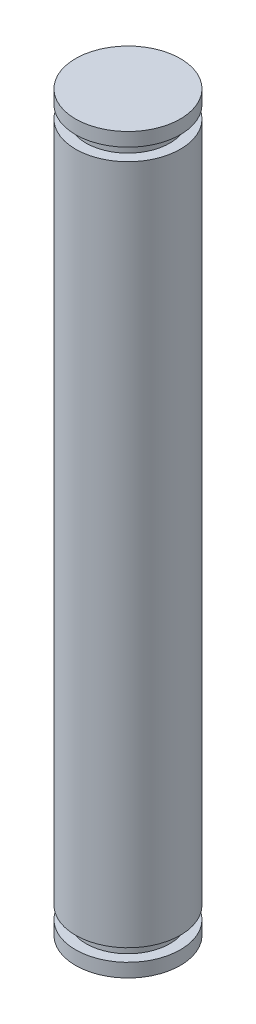
ISO-10303-21;
HEADER;
FILE_DESCRIPTION(('STEP AP214'),'2;1');
FILE_NAME('part.step','',(''),(''),'','','');
FILE_SCHEMA(('AUTOMOTIVE_DESIGN { 1 0 10303 214 1 1 1 1 }'));
ENDSEC;
DATA;
#1=APPLICATION_CONTEXT('core data for automotive mechanical design processes');
#2=APPLICATION_PROTOCOL_DEFINITION('international standard','automotive_design',2000,#1);
#3=PRODUCT_CONTEXT('',#1,'mechanical');
#4=PRODUCT('Part','Part','',(#3));
#5=PRODUCT_RELATED_PRODUCT_CATEGORY('part','',(#4));
#6=PRODUCT_DEFINITION_FORMATION('','',#4);
#7=PRODUCT_DEFINITION_CONTEXT('part definition',#1,'design');
#8=PRODUCT_DEFINITION('design','',#6,#7);
#9=PRODUCT_DEFINITION_SHAPE('','',#8);
#10=(LENGTH_UNIT() NAMED_UNIT(*) SI_UNIT(.MILLI.,.METRE.));
#11=(NAMED_UNIT(*) PLANE_ANGLE_UNIT() SI_UNIT($,.RADIAN.));
#12=(NAMED_UNIT(*) SI_UNIT($,.STERADIAN.) SOLID_ANGLE_UNIT());
#13=UNCERTAINTY_MEASURE_WITH_UNIT(LENGTH_MEASURE(1.E-05),#10,'distance_accuracy_value','');
#14=(GEOMETRIC_REPRESENTATION_CONTEXT(3) GLOBAL_UNCERTAINTY_ASSIGNED_CONTEXT((#13)) GLOBAL_UNIT_ASSIGNED_CONTEXT((#10,
#11,#12)) REPRESENTATION_CONTEXT('',''));
#15=CARTESIAN_POINT('',(0.,0.,0.));
#16=DIRECTION('',(0.,0.,1.));
#17=DIRECTION('',(1.,0.,0.));
#18=AXIS2_PLACEMENT_3D('',#15,#16,#17);
#19=CARTESIAN_POINT('',(0.,0.,0.));
#20=DIRECTION('',(0.,-1.,0.));
#21=DIRECTION('',(0.,0.,-1.));
#22=AXIS2_PLACEMENT_3D('',#19,#20,#21);
#23=PLANE('',#22);
#24=CARTESIAN_POINT('',(0.,0.,0.));
#25=DIRECTION('',(0.,1.,0.));
#26=DIRECTION('',(0.,0.,1.));
#27=AXIS2_PLACEMENT_3D('',#24,#25,#26);
#28=CIRCLE('',#27,5.);
#29=CARTESIAN_POINT('',(0.,0.,5.));
#30=VERTEX_POINT('',#29);
#31=EDGE_CURVE('E10',#30,#30,#28,.T.);
#32=ORIENTED_EDGE('',*,*,#31,.F.);
#33=EDGE_LOOP('',(#32));
#34=FACE_BOUND('',#33,.T.);
#35=ADVANCED_FACE('F35',(#34),#23,.T.);
#36=CARTESIAN_POINT('',(0.,70.,0.));
#37=DIRECTION('',(0.,1.,0.));
#38=DIRECTION('',(0.,0.,1.));
#39=AXIS2_PLACEMENT_3D('',#36,#37,#38);
#40=CYLINDRICAL_SURFACE('',#39,5.);
#41=ORIENTED_EDGE('',*,*,#31,.T.);
#42=EDGE_LOOP('',(#41));
#43=FACE_BOUND('',#42,.T.);
#44=CARTESIAN_POINT('',(0.,1.3,0.));
#45=DIRECTION('',(0.,1.,0.));
#46=DIRECTION('',(0.,0.,1.));
#47=AXIS2_PLACEMENT_3D('',#44,#45,#46);
#48=CIRCLE('',#47,5.);
#49=CARTESIAN_POINT('',(0.,1.3,5.));
#50=VERTEX_POINT('',#49);
#51=EDGE_CURVE('E41',#50,#50,#48,.T.);
#52=ORIENTED_EDGE('',*,*,#51,.F.);
#53=EDGE_LOOP('',(#52));
#54=FACE_BOUND('',#53,.T.);
#55=ADVANCED_FACE('F89',(#43,#54),#40,.T.);
#56=CARTESIAN_POINT('',(-5.,1.3,0.));
#57=DIRECTION('',(0.,1.,0.));
#58=DIRECTION('',(0.,0.,1.));
#59=AXIS2_PLACEMENT_3D('',#56,#57,#58);
#60=PLANE('',#59);
#61=ORIENTED_EDGE('',*,*,#51,.T.);
#62=EDGE_LOOP('',(#61));
#63=FACE_BOUND('',#62,.T.);
#64=CARTESIAN_POINT('',(0.,1.3,0.));
#65=DIRECTION('',(0.,1.,0.));
#66=DIRECTION('',(0.,0.,1.));
#67=AXIS2_PLACEMENT_3D('',#64,#65,#66);
#68=CIRCLE('',#67,4.);
#69=CARTESIAN_POINT('',(0.,1.3,4.));
#70=VERTEX_POINT('',#69);
#71=EDGE_CURVE('E45',#70,#70,#68,.T.);
#72=ORIENTED_EDGE('',*,*,#71,.F.);
#73=EDGE_LOOP('',(#72));
#74=FACE_BOUND('',#73,.T.);
#75=ADVANCED_FACE('F94',(#63,#74),#60,.T.);
#76=CARTESIAN_POINT('',(0.,70.,0.));
#77=DIRECTION('',(0.,1.,0.));
#78=DIRECTION('',(0.,0.,1.));
#79=AXIS2_PLACEMENT_3D('',#76,#77,#78);
#80=CYLINDRICAL_SURFACE('',#79,4.);
#81=ORIENTED_EDGE('',*,*,#71,.T.);
#82=EDGE_LOOP('',(#81));
#83=FACE_BOUND('',#82,.T.);
#84=CARTESIAN_POINT('',(0.,2.5,0.));
#85=DIRECTION('',(0.,1.,0.));
#86=DIRECTION('',(0.,0.,1.));
#87=AXIS2_PLACEMENT_3D('',#84,#85,#86);
#88=CIRCLE('',#87,4.);
#89=CARTESIAN_POINT('',(0.,2.5,4.));
#90=VERTEX_POINT('',#89);
#91=EDGE_CURVE('E49',#90,#90,#88,.T.);
#92=ORIENTED_EDGE('',*,*,#91,.F.);
#93=EDGE_LOOP('',(#92));
#94=FACE_BOUND('',#93,.T.);
#95=ADVANCED_FACE('F98',(#83,#94),#80,.T.);
#96=CARTESIAN_POINT('',(-4.,2.5,0.));
#97=DIRECTION('',(0.,-1.,0.));
#98=DIRECTION('',(0.,0.,-1.));
#99=AXIS2_PLACEMENT_3D('',#96,#97,#98);
#100=PLANE('',#99);
#101=ORIENTED_EDGE('',*,*,#91,.T.);
#102=EDGE_LOOP('',(#101));
#103=FACE_BOUND('',#102,.T.);
#104=CARTESIAN_POINT('',(0.,2.5,0.));
#105=DIRECTION('',(0.,1.,0.));
#106=DIRECTION('',(0.,0.,1.));
#107=AXIS2_PLACEMENT_3D('',#104,#105,#106);
#108=CIRCLE('',#107,5.);
#109=CARTESIAN_POINT('',(0.,2.5,5.));
#110=VERTEX_POINT('',#109);
#111=EDGE_CURVE('E54',#110,#110,#108,.T.);
#112=ORIENTED_EDGE('',*,*,#111,.F.);
#113=EDGE_LOOP('',(#112));
#114=FACE_BOUND('',#113,.T.);
#115=ADVANCED_FACE('F104',(#103,#114),#100,.T.);
#116=CARTESIAN_POINT('',(0.,70.,0.));
#117=DIRECTION('',(0.,1.,0.));
#118=DIRECTION('',(0.,0.,1.));
#119=AXIS2_PLACEMENT_3D('',#116,#117,#118);
#120=CYLINDRICAL_SURFACE('',#119,5.);
#121=ORIENTED_EDGE('',*,*,#111,.T.);
#122=EDGE_LOOP('',(#121));
#123=FACE_BOUND('',#122,.T.);
#124=CARTESIAN_POINT('',(0.,67.5,0.));
#125=DIRECTION('',(0.,1.,0.));
#126=DIRECTION('',(0.,0.,1.));
#127=AXIS2_PLACEMENT_3D('',#124,#125,#126);
#128=CIRCLE('',#127,5.);
#129=CARTESIAN_POINT('',(0.,67.5,5.));
#130=VERTEX_POINT('',#129);
#131=EDGE_CURVE('E57',#130,#130,#128,.T.);
#132=ORIENTED_EDGE('',*,*,#131,.F.);
#133=EDGE_LOOP('',(#132));
#134=FACE_BOUND('',#133,.T.);
#135=ADVANCED_FACE('F108',(#123,#134),#120,.T.);
#136=CARTESIAN_POINT('',(-5.,67.5,0.));
#137=DIRECTION('',(0.,1.,0.));
#138=DIRECTION('',(0.,0.,1.));
#139=AXIS2_PLACEMENT_3D('',#136,#137,#138);
#140=PLANE('',#139);
#141=ORIENTED_EDGE('',*,*,#131,.T.);
#142=EDGE_LOOP('',(#141));
#143=FACE_BOUND('',#142,.T.);
#144=CARTESIAN_POINT('',(0.,67.5,0.));
#145=DIRECTION('',(0.,1.,0.));
#146=DIRECTION('',(0.,0.,1.));
#147=AXIS2_PLACEMENT_3D('',#144,#145,#146);
#148=CIRCLE('',#147,4.);
#149=CARTESIAN_POINT('',(0.,67.5,4.));
#150=VERTEX_POINT('',#149);
#151=EDGE_CURVE('E60',#150,#150,#148,.T.);
#152=ORIENTED_EDGE('',*,*,#151,.F.);
#153=EDGE_LOOP('',(#152));
#154=FACE_BOUND('',#153,.T.);
#155=ADVANCED_FACE('F112',(#143,#154),#140,.T.);
#156=CARTESIAN_POINT('',(0.,70.,0.));
#157=DIRECTION('',(0.,1.,0.));
#158=DIRECTION('',(0.,0.,1.));
#159=AXIS2_PLACEMENT_3D('',#156,#157,#158);
#160=CYLINDRICAL_SURFACE('',#159,4.);
#161=ORIENTED_EDGE('',*,*,#151,.T.);
#162=EDGE_LOOP('',(#161));
#163=FACE_BOUND('',#162,.T.);
#164=CARTESIAN_POINT('',(0.,68.7,0.));
#165=DIRECTION('',(0.,1.,0.));
#166=DIRECTION('',(0.,0.,1.));
#167=AXIS2_PLACEMENT_3D('',#164,#165,#166);
#168=CIRCLE('',#167,4.);
#169=CARTESIAN_POINT('',(0.,68.7,4.));
#170=VERTEX_POINT('',#169);
#171=EDGE_CURVE('E63',#170,#170,#168,.T.);
#172=ORIENTED_EDGE('',*,*,#171,.F.);
#173=EDGE_LOOP('',(#172));
#174=FACE_BOUND('',#173,.T.);
#175=ADVANCED_FACE('F85',(#163,#174),#160,.T.);
#176=CARTESIAN_POINT('',(-4.,68.7,0.));
#177=DIRECTION('',(0.,-1.,0.));
#178=DIRECTION('',(0.,0.,-1.));
#179=AXIS2_PLACEMENT_3D('',#176,#177,#178);
#180=PLANE('',#179);
#181=ORIENTED_EDGE('',*,*,#171,.T.);
#182=EDGE_LOOP('',(#181));
#183=FACE_BOUND('',#182,.T.);
#184=CARTESIAN_POINT('',(0.,68.7,0.));
#185=DIRECTION('',(0.,1.,0.));
#186=DIRECTION('',(0.,0.,1.));
#187=AXIS2_PLACEMENT_3D('',#184,#185,#186);
#188=CIRCLE('',#187,5.);
#189=CARTESIAN_POINT('',(0.,68.7,5.));
#190=VERTEX_POINT('',#189);
#191=EDGE_CURVE('E66',#190,#190,#188,.T.);
#192=ORIENTED_EDGE('',*,*,#191,.F.);
#193=EDGE_LOOP('',(#192));
#194=FACE_BOUND('',#193,.T.);
#195=ADVANCED_FACE('F77',(#183,#194),#180,.T.);
#196=CARTESIAN_POINT('',(0.,70.,0.));
#197=DIRECTION('',(0.,1.,0.));
#198=DIRECTION('',(0.,0.,1.));
#199=AXIS2_PLACEMENT_3D('',#196,#197,#198);
#200=CYLINDRICAL_SURFACE('',#199,5.);
#201=ORIENTED_EDGE('',*,*,#191,.T.);
#202=EDGE_LOOP('',(#201));
#203=FACE_BOUND('',#202,.T.);
#204=CARTESIAN_POINT('',(0.,70.,0.));
#205=DIRECTION('',(0.,1.,0.));
#206=DIRECTION('',(0.,0.,1.));
#207=AXIS2_PLACEMENT_3D('',#204,#205,#206);
#208=CIRCLE('',#207,5.);
#209=CARTESIAN_POINT('',(0.,70.,5.));
#210=VERTEX_POINT('',#209);
#211=EDGE_CURVE('E69',#210,#210,#208,.T.);
#212=ORIENTED_EDGE('',*,*,#211,.F.);
#213=EDGE_LOOP('',(#212));
#214=FACE_BOUND('',#213,.T.);
#215=ADVANCED_FACE('F75',(#203,#214),#200,.T.);
#216=CARTESIAN_POINT('',(-5.,70.,0.));
#217=DIRECTION('',(0.,1.,0.));
#218=DIRECTION('',(0.,0.,1.));
#219=AXIS2_PLACEMENT_3D('',#216,#217,#218);
#220=PLANE('',#219);
#221=ORIENTED_EDGE('',*,*,#211,.T.);
#222=EDGE_LOOP('',(#221));
#223=FACE_BOUND('',#222,.T.);
#224=ADVANCED_FACE('F73',(#223),#220,.T.);
#225=CLOSED_SHELL('',(#35,#55,#75,#95,#115,#135,#155,#175,#195,#215,#224));
#226=MANIFOLD_SOLID_BREP('B2',#225);
#227=ADVANCED_BREP_SHAPE_REPRESENTATION('',(#18,#226),#14);
#228=SHAPE_DEFINITION_REPRESENTATION(#9,#227);
ENDSEC;
END-ISO-10303-21;
